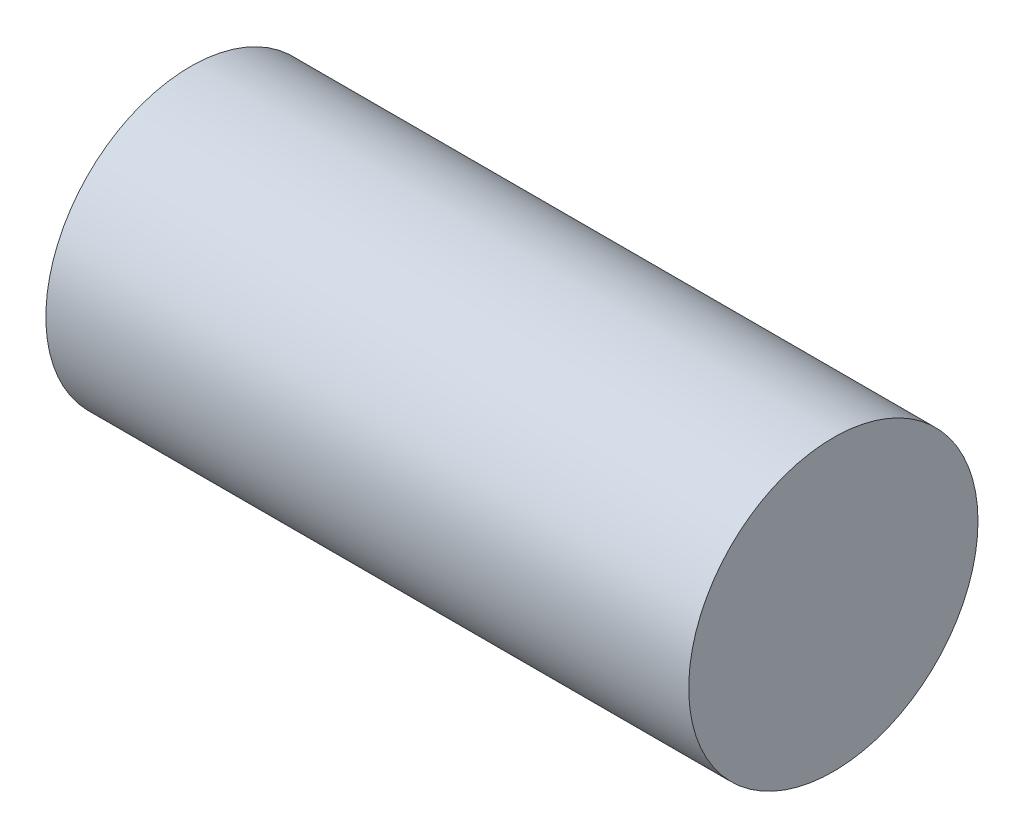
ISO-10303-21;
HEADER;
FILE_DESCRIPTION(('STEP AP214'),'2;1');
FILE_NAME('part.step','',(''),(''),'','','');
FILE_SCHEMA(('AUTOMOTIVE_DESIGN { 1 0 10303 214 1 1 1 1 }'));
ENDSEC;
DATA;
#1=APPLICATION_CONTEXT('core data for automotive mechanical design processes');
#2=APPLICATION_PROTOCOL_DEFINITION('international standard','automotive_design',2000,#1);
#3=PRODUCT_CONTEXT('',#1,'mechanical');
#4=PRODUCT('Part','Part','',(#3));
#5=PRODUCT_RELATED_PRODUCT_CATEGORY('part','',(#4));
#6=PRODUCT_DEFINITION_FORMATION('','',#4);
#7=PRODUCT_DEFINITION_CONTEXT('part definition',#1,'design');
#8=PRODUCT_DEFINITION('design','',#6,#7);
#9=PRODUCT_DEFINITION_SHAPE('','',#8);
#10=(LENGTH_UNIT() NAMED_UNIT(*) SI_UNIT(.MILLI.,.METRE.));
#11=(NAMED_UNIT(*) PLANE_ANGLE_UNIT() SI_UNIT($,.RADIAN.));
#12=(NAMED_UNIT(*) SI_UNIT($,.STERADIAN.) SOLID_ANGLE_UNIT());
#13=UNCERTAINTY_MEASURE_WITH_UNIT(LENGTH_MEASURE(1.E-05),#10,'distance_accuracy_value','');
#14=(GEOMETRIC_REPRESENTATION_CONTEXT(3) GLOBAL_UNCERTAINTY_ASSIGNED_CONTEXT((#13)) GLOBAL_UNIT_ASSIGNED_CONTEXT((#10,
#11,#12)) REPRESENTATION_CONTEXT('',''));
#15=CARTESIAN_POINT('',(0.,0.,0.));
#16=DIRECTION('',(0.,0.,1.));
#17=DIRECTION('',(1.,0.,0.));
#18=AXIS2_PLACEMENT_3D('',#15,#16,#17);
#19=CARTESIAN_POINT('',(20.,-4.70611928017284,10.6399218508256));
#20=DIRECTION('',(-1.,0.,0.));
#21=DIRECTION('',(0.,0.,1.));
#22=AXIS2_PLACEMENT_3D('',#19,#20,#21);
#23=CYLINDRICAL_SURFACE('',#22,4.5);
#24=CARTESIAN_POINT('',(20.,-4.70611928017284,10.6399218508256));
#25=DIRECTION('',(1.,0.,0.));
#26=DIRECTION('',(0.,0.,-1.));
#27=AXIS2_PLACEMENT_3D('',#24,#25,#26);
#28=CIRCLE('',#27,4.5);
#29=CARTESIAN_POINT('',(20.,-4.70611928017284,6.13992185082557));
#30=VERTEX_POINT('',#29);
#31=EDGE_CURVE('E10',#30,#30,#28,.T.);
#32=ORIENTED_EDGE('',*,*,#31,.F.);
#33=EDGE_LOOP('',(#32));
#34=FACE_BOUND('',#33,.T.);
#35=CARTESIAN_POINT('',(0.,-4.70611928017284,10.6399218508256));
#36=DIRECTION('',(1.,0.,0.));
#37=DIRECTION('',(0.,0.,-1.));
#38=AXIS2_PLACEMENT_3D('',#35,#36,#37);
#39=CIRCLE('',#38,4.5);
#40=CARTESIAN_POINT('',(0.,-4.70611928017284,6.13992185082557));
#41=VERTEX_POINT('',#40);
#42=EDGE_CURVE('E40',#41,#41,#39,.T.);
#43=ORIENTED_EDGE('',*,*,#42,.T.);
#44=EDGE_LOOP('',(#43));
#45=FACE_BOUND('',#44,.T.);
#46=ADVANCED_FACE('F37',(#34,#45),#23,.T.);
#47=CARTESIAN_POINT('',(20.,-4.70611928017284,10.6399218508256));
#48=DIRECTION('',(1.,0.,0.));
#49=DIRECTION('',(0.,0.,-1.));
#50=AXIS2_PLACEMENT_3D('',#47,#48,#49);
#51=PLANE('',#50);
#52=ORIENTED_EDGE('',*,*,#31,.T.);
#53=EDGE_LOOP('',(#52));
#54=FACE_BOUND('',#53,.T.);
#55=ADVANCED_FACE('F54',(#54),#51,.T.);
#56=CARTESIAN_POINT('',(0.,-4.70611928017284,10.6399218508256));
#57=DIRECTION('',(1.,0.,0.));
#58=DIRECTION('',(0.,0.,-1.));
#59=AXIS2_PLACEMENT_3D('',#56,#57,#58);
#60=PLANE('',#59);
#61=ORIENTED_EDGE('',*,*,#42,.F.);
#62=EDGE_LOOP('',(#61));
#63=FACE_BOUND('',#62,.T.);
#64=ADVANCED_FACE('F52',(#63),#60,.F.);
#65=CLOSED_SHELL('',(#46,#55,#64));
#66=MANIFOLD_SOLID_BREP('B2',#65);
#67=ADVANCED_BREP_SHAPE_REPRESENTATION('',(#18,#66),#14);
#68=SHAPE_DEFINITION_REPRESENTATION(#9,#67);
ENDSEC;
END-ISO-10303-21;
